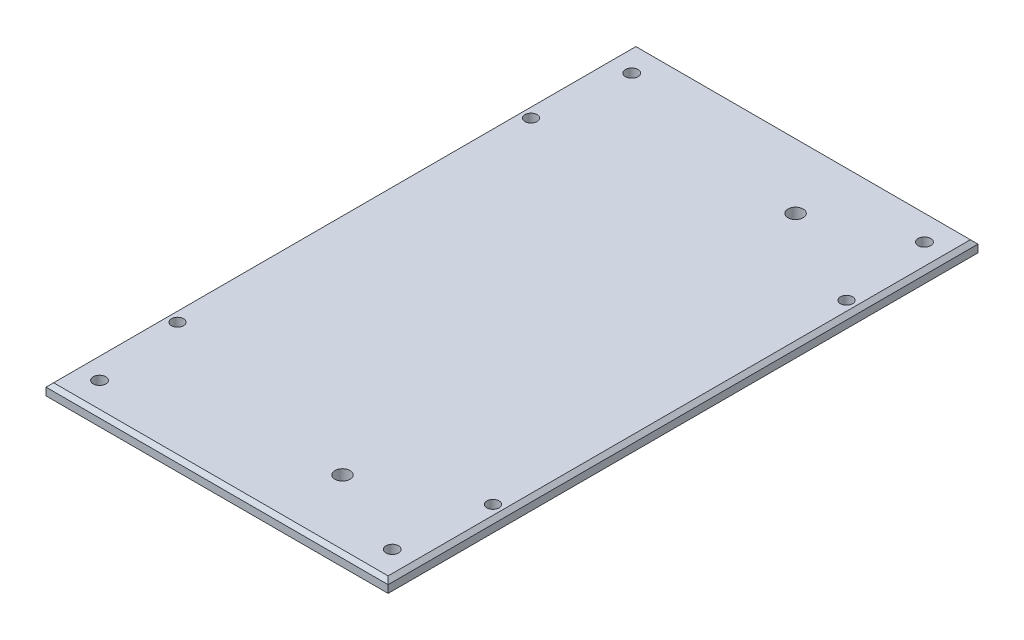
ISO-10303-21;
HEADER;
FILE_DESCRIPTION(('STEP AP214'),'2;1');
FILE_NAME('part.step','',(''),(''),'','','');
FILE_SCHEMA(('AUTOMOTIVE_DESIGN { 1 0 10303 214 1 1 1 1 }'));
ENDSEC;
DATA;
#1=APPLICATION_CONTEXT('core data for automotive mechanical design processes');
#2=APPLICATION_PROTOCOL_DEFINITION('international standard','automotive_design',2000,#1);
#3=PRODUCT_CONTEXT('',#1,'mechanical');
#4=PRODUCT('Part','Part','',(#3));
#5=PRODUCT_RELATED_PRODUCT_CATEGORY('part','',(#4));
#6=PRODUCT_DEFINITION_FORMATION('','',#4);
#7=PRODUCT_DEFINITION_CONTEXT('part definition',#1,'design');
#8=PRODUCT_DEFINITION('design','',#6,#7);
#9=PRODUCT_DEFINITION_SHAPE('','',#8);
#10=(LENGTH_UNIT() NAMED_UNIT(*) SI_UNIT(.MILLI.,.METRE.));
#11=(NAMED_UNIT(*) PLANE_ANGLE_UNIT() SI_UNIT($,.RADIAN.));
#12=(NAMED_UNIT(*) SI_UNIT($,.STERADIAN.) SOLID_ANGLE_UNIT());
#13=UNCERTAINTY_MEASURE_WITH_UNIT(LENGTH_MEASURE(1.E-05),#10,'distance_accuracy_value','');
#14=(GEOMETRIC_REPRESENTATION_CONTEXT(3) GLOBAL_UNCERTAINTY_ASSIGNED_CONTEXT((#13)) GLOBAL_UNIT_ASSIGNED_CONTEXT((#10,
#11,#12)) REPRESENTATION_CONTEXT('',''));
#15=CARTESIAN_POINT('',(0.,0.,0.));
#16=DIRECTION('',(0.,0.,1.));
#17=DIRECTION('',(1.,0.,0.));
#18=AXIS2_PLACEMENT_3D('',#15,#16,#17);
#19=CARTESIAN_POINT('',(0.,3.,0.));
#20=DIRECTION('',(0.,1.,0.));
#21=DIRECTION('',(0.,0.,1.));
#22=AXIS2_PLACEMENT_3D('',#19,#20,#21);
#23=PLANE('',#22);
#24=CARTESIAN_POINT('',(15.,3.,59.5862068965518));
#25=DIRECTION('',(0.,1.,0.));
#26=DIRECTION('',(0.,0.,1.));
#27=AXIS2_PLACEMENT_3D('',#24,#25,#26);
#28=CIRCLE('',#27,2.);
#29=CARTESIAN_POINT('',(15.,3.,61.5862068965518));
#30=VERTEX_POINT('',#29);
#31=EDGE_CURVE('E297',#30,#30,#28,.T.);
#32=ORIENTED_EDGE('',*,*,#31,.F.);
#33=EDGE_LOOP('',(#32));
#34=FACE_BOUND('',#33,.T.);
#35=CARTESIAN_POINT('',(15.,3.,-59.5862068965517));
#36=DIRECTION('',(0.,1.,0.));
#37=DIRECTION('',(0.,0.,-1.));
#38=AXIS2_PLACEMENT_3D('',#35,#36,#37);
#39=CIRCLE('',#38,2.);
#40=CARTESIAN_POINT('',(15.,3.,-61.5862068965517));
#41=VERTEX_POINT('',#40);
#42=EDGE_CURVE('E294',#41,#41,#39,.T.);
#43=ORIENTED_EDGE('',*,*,#42,.F.);
#44=EDGE_LOOP('',(#43));
#45=FACE_BOUND('',#44,.T.);
#46=CARTESIAN_POINT('',(-41.5,3.,46.5));
#47=DIRECTION('',(0.,1.,0.));
#48=DIRECTION('',(0.,0.,1.));
#49=AXIS2_PLACEMENT_3D('',#46,#47,#48);
#50=CIRCLE('',#49,1.60000000000001);
#51=CARTESIAN_POINT('',(-41.5,3.,48.1));
#52=VERTEX_POINT('',#51);
#53=EDGE_CURVE('E276',#52,#52,#50,.T.);
#54=ORIENTED_EDGE('',*,*,#53,.F.);
#55=EDGE_LOOP('',(#54));
#56=FACE_BOUND('',#55,.T.);
#57=CARTESIAN_POINT('',(41.5,3.,46.5));
#58=DIRECTION('',(0.,1.,0.));
#59=DIRECTION('',(0.,0.,1.));
#60=AXIS2_PLACEMENT_3D('',#57,#58,#59);
#61=CIRCLE('',#60,1.60000000000001);
#62=CARTESIAN_POINT('',(41.5,3.,48.1));
#63=VERTEX_POINT('',#62);
#64=EDGE_CURVE('E283',#63,#63,#61,.T.);
#65=ORIENTED_EDGE('',*,*,#64,.F.);
#66=EDGE_LOOP('',(#65));
#67=FACE_BOUND('',#66,.T.);
#68=CARTESIAN_POINT('',(41.5,3.,-46.5));
#69=DIRECTION('',(0.,1.,0.));
#70=DIRECTION('',(0.,0.,1.));
#71=AXIS2_PLACEMENT_3D('',#68,#69,#70);
#72=CIRCLE('',#71,1.60000000000001);
#73=CARTESIAN_POINT('',(41.5,3.,-44.9));
#74=VERTEX_POINT('',#73);
#75=EDGE_CURVE('E289',#74,#74,#72,.T.);
#76=ORIENTED_EDGE('',*,*,#75,.F.);
#77=EDGE_LOOP('',(#76));
#78=FACE_BOUND('',#77,.T.);
#79=CARTESIAN_POINT('',(-41.5,3.,-46.5));
#80=DIRECTION('',(0.,1.,0.));
#81=DIRECTION('',(0.,0.,1.));
#82=AXIS2_PLACEMENT_3D('',#79,#80,#81);
#83=CIRCLE('',#82,1.6);
#84=CARTESIAN_POINT('',(-41.5,3.,-44.9));
#85=VERTEX_POINT('',#84);
#86=EDGE_CURVE('E270',#85,#85,#83,.T.);
#87=ORIENTED_EDGE('',*,*,#86,.F.);
#88=EDGE_LOOP('',(#87));
#89=FACE_BOUND('',#88,.T.);
#90=CARTESIAN_POINT('',(38.5,3.,-70.));
#91=DIRECTION('',(0.,1.,0.));
#92=DIRECTION('',(0.,0.,1.));
#93=AXIS2_PLACEMENT_3D('',#90,#91,#92);
#94=CIRCLE('',#93,1.65517241379311);
#95=CARTESIAN_POINT('',(38.5,3.,-68.3448275862069));
#96=VERTEX_POINT('',#95);
#97=EDGE_CURVE('E254',#96,#96,#94,.T.);
#98=ORIENTED_EDGE('',*,*,#97,.F.);
#99=EDGE_LOOP('',(#98));
#100=FACE_BOUND('',#99,.T.);
#101=CARTESIAN_POINT('',(38.5,3.,70.));
#102=DIRECTION('',(0.,1.,0.));
#103=DIRECTION('',(0.,0.,1.));
#104=AXIS2_PLACEMENT_3D('',#101,#102,#103);
#105=CIRCLE('',#104,1.65517241379311);
#106=CARTESIAN_POINT('',(38.5,3.,71.6551724137931));
#107=VERTEX_POINT('',#106);
#108=EDGE_CURVE('E122',#107,#107,#105,.T.);
#109=ORIENTED_EDGE('',*,*,#108,.F.);
#110=EDGE_LOOP('',(#109));
#111=FACE_BOUND('',#110,.T.);
#112=DIRECTION('',(1.,0.,0.));
#113=VECTOR('',#112,1.);
#114=CARTESIAN_POINT('',(45.,3.,76.5862068965517));
#115=LINE('',#114,#113);
#116=CARTESIAN_POINT('',(-44.,3.,76.5862068965517));
#117=VERTEX_POINT('',#116);
#118=CARTESIAN_POINT('',(44.,3.,76.5862068965517));
#119=VERTEX_POINT('',#118);
#120=EDGE_CURVE('E137',#117,#119,#115,.T.);
#121=ORIENTED_EDGE('',*,*,#120,.T.);
#122=DIRECTION('',(0.,0.,-1.));
#123=VECTOR('',#122,1.);
#124=CARTESIAN_POINT('',(44.,3.,-76.5862068965517));
#125=LINE('',#124,#123);
#126=CARTESIAN_POINT('',(44.,3.,-76.5862068965517));
#127=VERTEX_POINT('',#126);
#128=EDGE_CURVE('E148',#119,#127,#125,.T.);
#129=ORIENTED_EDGE('',*,*,#128,.T.);
#130=DIRECTION('',(-1.,0.,0.));
#131=VECTOR('',#130,1.);
#132=CARTESIAN_POINT('',(-45.,3.,-76.5862068965517));
#133=LINE('',#132,#131);
#134=CARTESIAN_POINT('',(-44.,3.,-76.5862068965517));
#135=VERTEX_POINT('',#134);
#136=EDGE_CURVE('E106',#127,#135,#133,.T.);
#137=ORIENTED_EDGE('',*,*,#136,.T.);
#138=DIRECTION('',(0.,0.,1.));
#139=VECTOR('',#138,1.);
#140=CARTESIAN_POINT('',(-44.,3.,76.5862068965517));
#141=LINE('',#140,#139);
#142=EDGE_CURVE('E145',#135,#117,#141,.T.);
#143=ORIENTED_EDGE('',*,*,#142,.T.);
#144=EDGE_LOOP('',(#121,#129,#137,#143));
#145=FACE_BOUND('',#144,.T.);
#146=CARTESIAN_POINT('',(-38.5,3.,70.));
#147=DIRECTION('',(0.,1.,0.));
#148=DIRECTION('',(0.,0.,1.));
#149=AXIS2_PLACEMENT_3D('',#146,#147,#148);
#150=CIRCLE('',#149,1.65517241379311);
#151=CARTESIAN_POINT('',(-38.5,3.,71.6551724137931));
#152=VERTEX_POINT('',#151);
#153=EDGE_CURVE('E249',#152,#152,#150,.T.);
#154=ORIENTED_EDGE('',*,*,#153,.F.);
#155=EDGE_LOOP('',(#154));
#156=FACE_BOUND('',#155,.T.);
#157=CARTESIAN_POINT('',(-38.5,3.,-70.));
#158=DIRECTION('',(0.,1.,0.));
#159=DIRECTION('',(0.,0.,1.));
#160=AXIS2_PLACEMENT_3D('',#157,#158,#159);
#161=CIRCLE('',#160,1.65517241379311);
#162=CARTESIAN_POINT('',(-38.5,3.,-68.3448275862069));
#163=VERTEX_POINT('',#162);
#164=EDGE_CURVE('E262',#163,#163,#161,.T.);
#165=ORIENTED_EDGE('',*,*,#164,.F.);
#166=EDGE_LOOP('',(#165));
#167=FACE_BOUND('',#166,.T.);
#168=ADVANCED_FACE('F40',(#34,#45,#56,#67,#78,#89,#100,#111,#145,#156,#167),#23,.T.);
#169=CARTESIAN_POINT('',(0.,0.,0.));
#170=DIRECTION('',(0.,1.,0.));
#171=DIRECTION('',(0.,0.,1.));
#172=AXIS2_PLACEMENT_3D('',#169,#170,#171);
#173=PLANE('',#172);
#174=CARTESIAN_POINT('',(15.,0.,59.5862068965518));
#175=DIRECTION('',(0.,1.,0.));
#176=DIRECTION('',(0.,0.,1.));
#177=AXIS2_PLACEMENT_3D('',#174,#175,#176);
#178=CIRCLE('',#177,2.);
#179=CARTESIAN_POINT('',(15.,0.,61.5862068965518));
#180=VERTEX_POINT('',#179);
#181=EDGE_CURVE('E280',#180,#180,#178,.F.);
#182=ORIENTED_EDGE('',*,*,#181,.F.);
#183=EDGE_LOOP('',(#182));
#184=FACE_BOUND('',#183,.T.);
#185=CARTESIAN_POINT('',(15.,0.,-59.5862068965517));
#186=DIRECTION('',(0.,1.,0.));
#187=DIRECTION('',(0.,0.,1.));
#188=AXIS2_PLACEMENT_3D('',#185,#186,#187);
#189=CIRCLE('',#188,2.);
#190=CARTESIAN_POINT('',(15.,0.,-57.5862068965517));
#191=VERTEX_POINT('',#190);
#192=EDGE_CURVE('E298',#191,#191,#189,.F.);
#193=ORIENTED_EDGE('',*,*,#192,.F.);
#194=EDGE_LOOP('',(#193));
#195=FACE_BOUND('',#194,.T.);
#196=CARTESIAN_POINT('',(-41.5,0.,46.5));
#197=DIRECTION('',(0.,1.,0.));
#198=DIRECTION('',(0.,0.,1.));
#199=AXIS2_PLACEMENT_3D('',#196,#197,#198);
#200=CIRCLE('',#199,1.60000000000001);
#201=CARTESIAN_POINT('',(-41.5,0.,48.1));
#202=VERTEX_POINT('',#201);
#203=EDGE_CURVE('E279',#202,#202,#200,.T.);
#204=ORIENTED_EDGE('',*,*,#203,.T.);
#205=EDGE_LOOP('',(#204));
#206=FACE_BOUND('',#205,.T.);
#207=CARTESIAN_POINT('',(41.5,0.,46.5));
#208=DIRECTION('',(0.,1.,0.));
#209=DIRECTION('',(0.,0.,1.));
#210=AXIS2_PLACEMENT_3D('',#207,#208,#209);
#211=CIRCLE('',#210,1.60000000000001);
#212=CARTESIAN_POINT('',(41.5,0.,48.1));
#213=VERTEX_POINT('',#212);
#214=EDGE_CURVE('E286',#213,#213,#211,.T.);
#215=ORIENTED_EDGE('',*,*,#214,.T.);
#216=EDGE_LOOP('',(#215));
#217=FACE_BOUND('',#216,.T.);
#218=CARTESIAN_POINT('',(41.5,0.,-46.5));
#219=DIRECTION('',(0.,1.,0.));
#220=DIRECTION('',(0.,0.,1.));
#221=AXIS2_PLACEMENT_3D('',#218,#219,#220);
#222=CIRCLE('',#221,1.60000000000001);
#223=CARTESIAN_POINT('',(41.5,0.,-44.9));
#224=VERTEX_POINT('',#223);
#225=EDGE_CURVE('E273',#224,#224,#222,.T.);
#226=ORIENTED_EDGE('',*,*,#225,.T.);
#227=EDGE_LOOP('',(#226));
#228=FACE_BOUND('',#227,.T.);
#229=CARTESIAN_POINT('',(-41.5,0.,-46.5));
#230=DIRECTION('',(0.,1.,0.));
#231=DIRECTION('',(0.,0.,1.));
#232=AXIS2_PLACEMENT_3D('',#229,#230,#231);
#233=CIRCLE('',#232,1.6);
#234=CARTESIAN_POINT('',(-41.5,0.,-44.9));
#235=VERTEX_POINT('',#234);
#236=EDGE_CURVE('E267',#235,#235,#233,.T.);
#237=ORIENTED_EDGE('',*,*,#236,.T.);
#238=EDGE_LOOP('',(#237));
#239=FACE_BOUND('',#238,.T.);
#240=DIRECTION('',(-1.,0.,0.));
#241=VECTOR('',#240,1.);
#242=CARTESIAN_POINT('',(45.,0.,-77.5862068965517));
#243=LINE('',#242,#241);
#244=CARTESIAN_POINT('',(45.,0.,-77.5862068965517));
#245=VERTEX_POINT('',#244);
#246=CARTESIAN_POINT('',(-45.,0.,-77.5862068965517));
#247=VERTEX_POINT('',#246);
#248=EDGE_CURVE('E114',#245,#247,#243,.T.);
#249=ORIENTED_EDGE('',*,*,#248,.F.);
#250=DIRECTION('',(0.,0.,-1.));
#251=VECTOR('',#250,1.);
#252=CARTESIAN_POINT('',(45.,0.,77.5862068965518));
#253=LINE('',#252,#251);
#254=CARTESIAN_POINT('',(45.,0.,77.5862068965518));
#255=VERTEX_POINT('',#254);
#256=EDGE_CURVE('E130',#255,#245,#253,.T.);
#257=ORIENTED_EDGE('',*,*,#256,.F.);
#258=DIRECTION('',(1.,0.,0.));
#259=VECTOR('',#258,1.);
#260=CARTESIAN_POINT('',(-45.,0.,77.5862068965518));
#261=LINE('',#260,#259);
#262=CARTESIAN_POINT('',(-45.,0.,77.5862068965518));
#263=VERTEX_POINT('',#262);
#264=EDGE_CURVE('E116',#263,#255,#261,.T.);
#265=ORIENTED_EDGE('',*,*,#264,.F.);
#266=DIRECTION('',(0.,0.,1.));
#267=VECTOR('',#266,1.);
#268=CARTESIAN_POINT('',(-45.,0.,-77.5862068965517));
#269=LINE('',#268,#267);
#270=EDGE_CURVE('E100',#247,#263,#269,.T.);
#271=ORIENTED_EDGE('',*,*,#270,.F.);
#272=EDGE_LOOP('',(#249,#257,#265,#271));
#273=FACE_BOUND('',#272,.T.);
#274=CARTESIAN_POINT('',(38.5,0.,70.));
#275=DIRECTION('',(0.,1.,0.));
#276=DIRECTION('',(0.,0.,1.));
#277=AXIS2_PLACEMENT_3D('',#274,#275,#276);
#278=CIRCLE('',#277,1.65517241379311);
#279=CARTESIAN_POINT('',(38.5,0.,71.6551724137931));
#280=VERTEX_POINT('',#279);
#281=EDGE_CURVE('E125',#280,#280,#278,.T.);
#282=ORIENTED_EDGE('',*,*,#281,.T.);
#283=EDGE_LOOP('',(#282));
#284=FACE_BOUND('',#283,.T.);
#285=CARTESIAN_POINT('',(-38.5,0.,70.));
#286=DIRECTION('',(0.,1.,0.));
#287=DIRECTION('',(0.,0.,1.));
#288=AXIS2_PLACEMENT_3D('',#285,#286,#287);
#289=CIRCLE('',#288,1.65517241379311);
#290=CARTESIAN_POINT('',(-38.5,0.,71.6551724137931));
#291=VERTEX_POINT('',#290);
#292=EDGE_CURVE('E252',#291,#291,#289,.T.);
#293=ORIENTED_EDGE('',*,*,#292,.T.);
#294=EDGE_LOOP('',(#293));
#295=FACE_BOUND('',#294,.T.);
#296=CARTESIAN_POINT('',(38.5,0.,-70.));
#297=DIRECTION('',(0.,1.,0.));
#298=DIRECTION('',(0.,0.,1.));
#299=AXIS2_PLACEMENT_3D('',#296,#297,#298);
#300=CIRCLE('',#299,1.65517241379311);
#301=CARTESIAN_POINT('',(38.5,0.,-68.3448275862069));
#302=VERTEX_POINT('',#301);
#303=EDGE_CURVE('E258',#302,#302,#300,.T.);
#304=ORIENTED_EDGE('',*,*,#303,.T.);
#305=EDGE_LOOP('',(#304));
#306=FACE_BOUND('',#305,.T.);
#307=CARTESIAN_POINT('',(-38.5,0.,-70.));
#308=DIRECTION('',(0.,1.,0.));
#309=DIRECTION('',(0.,0.,1.));
#310=AXIS2_PLACEMENT_3D('',#307,#308,#309);
#311=CIRCLE('',#310,1.65517241379311);
#312=CARTESIAN_POINT('',(-38.5,0.,-68.3448275862069));
#313=VERTEX_POINT('',#312);
#314=EDGE_CURVE('E264',#313,#313,#311,.T.);
#315=ORIENTED_EDGE('',*,*,#314,.T.);
#316=EDGE_LOOP('',(#315));
#317=FACE_BOUND('',#316,.T.);
#318=ADVANCED_FACE('F111',(#184,#195,#206,#217,#228,#239,#273,#284,#295,#306,#317),#173,.F.);
#319=CARTESIAN_POINT('',(45.,3.,-77.5862068965517));
#320=DIRECTION('',(0.,0.,1.));
#321=DIRECTION('',(1.,0.,0.));
#322=AXIS2_PLACEMENT_3D('',#319,#320,#321);
#323=PLANE('',#322);
#324=DIRECTION('',(0.,-1.,0.));
#325=VECTOR('',#324,1.);
#326=CARTESIAN_POINT('',(-45.,3.,-77.5862068965517));
#327=LINE('',#326,#325);
#328=CARTESIAN_POINT('',(-45.,1.99999999999997,-77.5862068965517));
#329=VERTEX_POINT('',#328);
#330=EDGE_CURVE('E96',#329,#247,#327,.T.);
#331=ORIENTED_EDGE('',*,*,#330,.F.);
#332=DIRECTION('',(1.,0.,0.));
#333=VECTOR('',#332,1.);
#334=CARTESIAN_POINT('',(45.,1.99999999999997,-77.5862068965517));
#335=LINE('',#334,#333);
#336=CARTESIAN_POINT('',(45.,1.99999999999997,-77.5862068965517));
#337=VERTEX_POINT('',#336);
#338=EDGE_CURVE('E143',#329,#337,#335,.T.);
#339=ORIENTED_EDGE('',*,*,#338,.T.);
#340=DIRECTION('',(0.,-1.,0.));
#341=VECTOR('',#340,1.);
#342=CARTESIAN_POINT('',(45.,3.,-77.5862068965517));
#343=LINE('',#342,#341);
#344=EDGE_CURVE('E120',#337,#245,#343,.T.);
#345=ORIENTED_EDGE('',*,*,#344,.T.);
#346=ORIENTED_EDGE('',*,*,#248,.T.);
#347=EDGE_LOOP('',(#331,#339,#345,#346));
#348=FACE_BOUND('',#347,.T.);
#349=ADVANCED_FACE('F118',(#348),#323,.F.);
#350=CARTESIAN_POINT('',(-45.,3.,-77.5862068965517));
#351=DIRECTION('',(1.,0.,0.));
#352=DIRECTION('',(0.,0.,-1.));
#353=AXIS2_PLACEMENT_3D('',#350,#351,#352);
#354=PLANE('',#353);
#355=DIRECTION('',(0.,-1.,0.));
#356=VECTOR('',#355,1.);
#357=CARTESIAN_POINT('',(-45.,3.,77.5862068965518));
#358=LINE('',#357,#356);
#359=CARTESIAN_POINT('',(-45.,1.99999999999997,77.5862068965518));
#360=VERTEX_POINT('',#359);
#361=EDGE_CURVE('E107',#360,#263,#358,.T.);
#362=ORIENTED_EDGE('',*,*,#361,.F.);
#363=DIRECTION('',(0.,0.,-1.));
#364=VECTOR('',#363,1.);
#365=CARTESIAN_POINT('',(-45.,2.00000000000003,-76.5862068965517));
#366=LINE('',#365,#364);
#367=EDGE_CURVE('E11',#360,#329,#366,.T.);
#368=ORIENTED_EDGE('',*,*,#367,.T.);
#369=ORIENTED_EDGE('',*,*,#330,.T.);
#370=ORIENTED_EDGE('',*,*,#270,.T.);
#371=EDGE_LOOP('',(#362,#368,#369,#370));
#372=FACE_BOUND('',#371,.T.);
#373=ADVANCED_FACE('F99',(#372),#354,.F.);
#374=CARTESIAN_POINT('',(-45.,3.,77.5862068965518));
#375=DIRECTION('',(0.,0.,-1.));
#376=DIRECTION('',(-1.,0.,0.));
#377=AXIS2_PLACEMENT_3D('',#374,#375,#376);
#378=PLANE('',#377);
#379=DIRECTION('',(0.,-1.,0.));
#380=VECTOR('',#379,1.);
#381=CARTESIAN_POINT('',(45.,3.,77.5862068965518));
#382=LINE('',#381,#380);
#383=CARTESIAN_POINT('',(45.,1.99999999999997,77.5862068965518));
#384=VERTEX_POINT('',#383);
#385=EDGE_CURVE('E133',#384,#255,#382,.T.);
#386=ORIENTED_EDGE('',*,*,#385,.F.);
#387=DIRECTION('',(-1.,0.,0.));
#388=VECTOR('',#387,1.);
#389=CARTESIAN_POINT('',(-45.,1.99999999999997,77.5862068965518));
#390=LINE('',#389,#388);
#391=EDGE_CURVE('E140',#384,#360,#390,.T.);
#392=ORIENTED_EDGE('',*,*,#391,.T.);
#393=ORIENTED_EDGE('',*,*,#361,.T.);
#394=ORIENTED_EDGE('',*,*,#264,.T.);
#395=EDGE_LOOP('',(#386,#392,#393,#394));
#396=FACE_BOUND('',#395,.T.);
#397=ADVANCED_FACE('F191',(#396),#378,.F.);
#398=CARTESIAN_POINT('',(45.,3.,77.5862068965518));
#399=DIRECTION('',(-1.,0.,0.));
#400=DIRECTION('',(0.,0.,1.));
#401=AXIS2_PLACEMENT_3D('',#398,#399,#400);
#402=PLANE('',#401);
#403=ORIENTED_EDGE('',*,*,#344,.F.);
#404=DIRECTION('',(0.,0.,1.));
#405=VECTOR('',#404,1.);
#406=CARTESIAN_POINT('',(45.,2.00000000000003,76.5862068965517));
#407=LINE('',#406,#405);
#408=EDGE_CURVE('E152',#337,#384,#407,.T.);
#409=ORIENTED_EDGE('',*,*,#408,.T.);
#410=ORIENTED_EDGE('',*,*,#385,.T.);
#411=ORIENTED_EDGE('',*,*,#256,.T.);
#412=EDGE_LOOP('',(#403,#409,#410,#411));
#413=FACE_BOUND('',#412,.T.);
#414=ADVANCED_FACE('F188',(#413),#402,.F.);
#415=CARTESIAN_POINT('',(38.5,3.,70.));
#416=DIRECTION('',(0.,-1.,0.));
#417=DIRECTION('',(0.,0.,-1.));
#418=AXIS2_PLACEMENT_3D('',#415,#416,#417);
#419=CYLINDRICAL_SURFACE('',#418,1.65517241379311);
#420=ORIENTED_EDGE('',*,*,#108,.T.);
#421=EDGE_LOOP('',(#420));
#422=FACE_BOUND('',#421,.T.);
#423=ORIENTED_EDGE('',*,*,#281,.F.);
#424=EDGE_LOOP('',(#423));
#425=FACE_BOUND('',#424,.T.);
#426=ADVANCED_FACE('F185',(#422,#425),#419,.F.);
#427=CARTESIAN_POINT('',(-38.5,3.,70.));
#428=DIRECTION('',(0.,-1.,0.));
#429=DIRECTION('',(0.,0.,-1.));
#430=AXIS2_PLACEMENT_3D('',#427,#428,#429);
#431=CYLINDRICAL_SURFACE('',#430,1.65517241379311);
#432=ORIENTED_EDGE('',*,*,#153,.T.);
#433=EDGE_LOOP('',(#432));
#434=FACE_BOUND('',#433,.T.);
#435=ORIENTED_EDGE('',*,*,#292,.F.);
#436=EDGE_LOOP('',(#435));
#437=FACE_BOUND('',#436,.T.);
#438=ADVANCED_FACE('F238',(#434,#437),#431,.F.);
#439=CARTESIAN_POINT('',(38.5,3.,-70.));
#440=DIRECTION('',(0.,-1.,0.));
#441=DIRECTION('',(0.,0.,-1.));
#442=AXIS2_PLACEMENT_3D('',#439,#440,#441);
#443=CYLINDRICAL_SURFACE('',#442,1.65517241379311);
#444=ORIENTED_EDGE('',*,*,#97,.T.);
#445=EDGE_LOOP('',(#444));
#446=FACE_BOUND('',#445,.T.);
#447=ORIENTED_EDGE('',*,*,#303,.F.);
#448=EDGE_LOOP('',(#447));
#449=FACE_BOUND('',#448,.T.);
#450=ADVANCED_FACE('F235',(#446,#449),#443,.F.);
#451=CARTESIAN_POINT('',(-38.5,3.,-70.));
#452=DIRECTION('',(0.,-1.,0.));
#453=DIRECTION('',(0.,0.,-1.));
#454=AXIS2_PLACEMENT_3D('',#451,#452,#453);
#455=CYLINDRICAL_SURFACE('',#454,1.65517241379311);
#456=ORIENTED_EDGE('',*,*,#164,.T.);
#457=EDGE_LOOP('',(#456));
#458=FACE_BOUND('',#457,.T.);
#459=ORIENTED_EDGE('',*,*,#314,.F.);
#460=EDGE_LOOP('',(#459));
#461=FACE_BOUND('',#460,.T.);
#462=ADVANCED_FACE('F231',(#458,#461),#455,.F.);
#463=CARTESIAN_POINT('',(-41.5,0.,-46.5));
#464=DIRECTION('',(0.,1.,0.));
#465=DIRECTION('',(0.,0.,1.));
#466=AXIS2_PLACEMENT_3D('',#463,#464,#465);
#467=CYLINDRICAL_SURFACE('',#466,1.6);
#468=ORIENTED_EDGE('',*,*,#236,.F.);
#469=EDGE_LOOP('',(#468));
#470=FACE_BOUND('',#469,.T.);
#471=ORIENTED_EDGE('',*,*,#86,.T.);
#472=EDGE_LOOP('',(#471));
#473=FACE_BOUND('',#472,.T.);
#474=ADVANCED_FACE('F228',(#470,#473),#467,.F.);
#475=CARTESIAN_POINT('',(41.5,0.,-46.5));
#476=DIRECTION('',(0.,1.,0.));
#477=DIRECTION('',(0.,0.,1.));
#478=AXIS2_PLACEMENT_3D('',#475,#476,#477);
#479=CYLINDRICAL_SURFACE('',#478,1.60000000000001);
#480=ORIENTED_EDGE('',*,*,#225,.F.);
#481=EDGE_LOOP('',(#480));
#482=FACE_BOUND('',#481,.T.);
#483=ORIENTED_EDGE('',*,*,#75,.T.);
#484=EDGE_LOOP('',(#483));
#485=FACE_BOUND('',#484,.T.);
#486=ADVANCED_FACE('F221',(#482,#485),#479,.F.);
#487=CARTESIAN_POINT('',(41.5,0.,46.5));
#488=DIRECTION('',(0.,1.,0.));
#489=DIRECTION('',(0.,0.,1.));
#490=AXIS2_PLACEMENT_3D('',#487,#488,#489);
#491=CYLINDRICAL_SURFACE('',#490,1.60000000000001);
#492=ORIENTED_EDGE('',*,*,#214,.F.);
#493=EDGE_LOOP('',(#492));
#494=FACE_BOUND('',#493,.T.);
#495=ORIENTED_EDGE('',*,*,#64,.T.);
#496=EDGE_LOOP('',(#495));
#497=FACE_BOUND('',#496,.T.);
#498=ADVANCED_FACE('F215',(#494,#497),#491,.F.);
#499=CARTESIAN_POINT('',(-41.5,0.,46.5));
#500=DIRECTION('',(0.,1.,0.));
#501=DIRECTION('',(0.,0.,1.));
#502=AXIS2_PLACEMENT_3D('',#499,#500,#501);
#503=CYLINDRICAL_SURFACE('',#502,1.60000000000001);
#504=ORIENTED_EDGE('',*,*,#203,.F.);
#505=EDGE_LOOP('',(#504));
#506=FACE_BOUND('',#505,.T.);
#507=ORIENTED_EDGE('',*,*,#53,.T.);
#508=EDGE_LOOP('',(#507));
#509=FACE_BOUND('',#508,.T.);
#510=ADVANCED_FACE('F205',(#506,#509),#503,.F.);
#511=CARTESIAN_POINT('',(0.,3.,76.5862068965517));
#512=DIRECTION('',(0.,0.707106781186548,0.707106781186548));
#513=DIRECTION('',(-1.,0.,0.));
#514=AXIS2_PLACEMENT_3D('',#511,#512,#513);
#515=PLANE('',#514);
#516=ORIENTED_EDGE('',*,*,#391,.F.);
#517=DIRECTION('',(-0.577350269189622,0.577350269189628,-0.577350269189628));
#518=VECTOR('',#517,1.);
#519=CARTESIAN_POINT('',(29.3333333333336,17.6666666666666,61.9195402298851));
#520=LINE('',#519,#518);
#521=EDGE_CURVE('E49',#384,#119,#520,.T.);
#522=ORIENTED_EDGE('',*,*,#521,.T.);
#523=ORIENTED_EDGE('',*,*,#120,.F.);
#524=DIRECTION('',(-0.577350269189626,-0.577350269189626,0.577350269189626));
#525=VECTOR('',#524,1.);
#526=CARTESIAN_POINT('',(-29.3333333333333,17.6666666666667,61.9195402298851));
#527=LINE('',#526,#525);
#528=EDGE_CURVE('E154',#117,#360,#527,.T.);
#529=ORIENTED_EDGE('',*,*,#528,.T.);
#530=EDGE_LOOP('',(#516,#522,#523,#529));
#531=FACE_BOUND('',#530,.T.);
#532=ADVANCED_FACE('F159',(#531),#515,.T.);
#533=CARTESIAN_POINT('',(0.,3.,-76.5862068965517));
#534=DIRECTION('',(0.,0.707106781186548,-0.707106781186548));
#535=DIRECTION('',(1.,0.,0.));
#536=AXIS2_PLACEMENT_3D('',#533,#534,#535);
#537=PLANE('',#536);
#538=ORIENTED_EDGE('',*,*,#136,.F.);
#539=DIRECTION('',(0.577350269189622,-0.577350269189628,-0.577350269189628));
#540=VECTOR('',#539,1.);
#541=CARTESIAN_POINT('',(29.3333333333336,17.6666666666666,-61.919540229885));
#542=LINE('',#541,#540);
#543=EDGE_CURVE('E64',#127,#337,#542,.T.);
#544=ORIENTED_EDGE('',*,*,#543,.T.);
#545=ORIENTED_EDGE('',*,*,#338,.F.);
#546=DIRECTION('',(0.577350269189626,0.577350269189626,0.577350269189626));
#547=VECTOR('',#546,1.);
#548=CARTESIAN_POINT('',(-29.3333333333333,17.6666666666667,-61.919540229885));
#549=LINE('',#548,#547);
#550=EDGE_CURVE('E56',#329,#135,#549,.T.);
#551=ORIENTED_EDGE('',*,*,#550,.T.);
#552=EDGE_LOOP('',(#538,#544,#545,#551));
#553=FACE_BOUND('',#552,.T.);
#554=ADVANCED_FACE('F165',(#553),#537,.T.);
#555=CARTESIAN_POINT('',(44.,3.,0.));
#556=DIRECTION('',(0.707106781186551,0.707106781186544,0.));
#557=DIRECTION('',(0.,0.,1.));
#558=AXIS2_PLACEMENT_3D('',#555,#556,#557);
#559=PLANE('',#558);
#560=ORIENTED_EDGE('',*,*,#521,.F.);
#561=ORIENTED_EDGE('',*,*,#408,.F.);
#562=ORIENTED_EDGE('',*,*,#543,.F.);
#563=ORIENTED_EDGE('',*,*,#128,.F.);
#564=EDGE_LOOP('',(#560,#561,#562,#563));
#565=FACE_BOUND('',#564,.T.);
#566=ADVANCED_FACE('F163',(#565),#559,.T.);
#567=CARTESIAN_POINT('',(-44.,3.,0.));
#568=DIRECTION('',(-0.707106781186548,0.707106781186548,0.));
#569=DIRECTION('',(0.,0.,-1.));
#570=AXIS2_PLACEMENT_3D('',#567,#568,#569);
#571=PLANE('',#570);
#572=ORIENTED_EDGE('',*,*,#550,.F.);
#573=ORIENTED_EDGE('',*,*,#367,.F.);
#574=ORIENTED_EDGE('',*,*,#528,.F.);
#575=ORIENTED_EDGE('',*,*,#142,.F.);
#576=EDGE_LOOP('',(#572,#573,#574,#575));
#577=FACE_BOUND('',#576,.T.);
#578=ADVANCED_FACE('F43',(#577),#571,.T.);
#579=CARTESIAN_POINT('',(15.,-5.65685424949239,-59.5862068965517));
#580=DIRECTION('',(0.,1.,0.));
#581=DIRECTION('',(0.,0.,1.));
#582=AXIS2_PLACEMENT_3D('',#579,#580,#581);
#583=CYLINDRICAL_SURFACE('',#582,2.);
#584=ORIENTED_EDGE('',*,*,#192,.T.);
#585=EDGE_LOOP('',(#584));
#586=FACE_BOUND('',#585,.T.);
#587=ORIENTED_EDGE('',*,*,#42,.T.);
#588=EDGE_LOOP('',(#587));
#589=FACE_BOUND('',#588,.T.);
#590=ADVANCED_FACE('F170',(#586,#589),#583,.F.);
#591=CARTESIAN_POINT('',(15.,-5.65685424949239,59.5862068965518));
#592=DIRECTION('',(0.,1.,0.));
#593=DIRECTION('',(0.,0.,1.));
#594=AXIS2_PLACEMENT_3D('',#591,#592,#593);
#595=CYLINDRICAL_SURFACE('',#594,2.);
#596=ORIENTED_EDGE('',*,*,#181,.T.);
#597=EDGE_LOOP('',(#596));
#598=FACE_BOUND('',#597,.T.);
#599=ORIENTED_EDGE('',*,*,#31,.T.);
#600=EDGE_LOOP('',(#599));
#601=FACE_BOUND('',#600,.T.);
#602=ADVANCED_FACE('F305',(#598,#601),#595,.F.);
#603=CLOSED_SHELL('',(#168,#318,#349,#373,#397,#414,#426,#438,#450,#462,#474,#486,#498,#510,
#532,#554,#566,#578,#590,#602));
#604=MANIFOLD_SOLID_BREP('B2',#603);
#605=ADVANCED_BREP_SHAPE_REPRESENTATION('',(#18,#604),#14);
#606=SHAPE_DEFINITION_REPRESENTATION(#9,#605);
ENDSEC;
END-ISO-10303-21;
